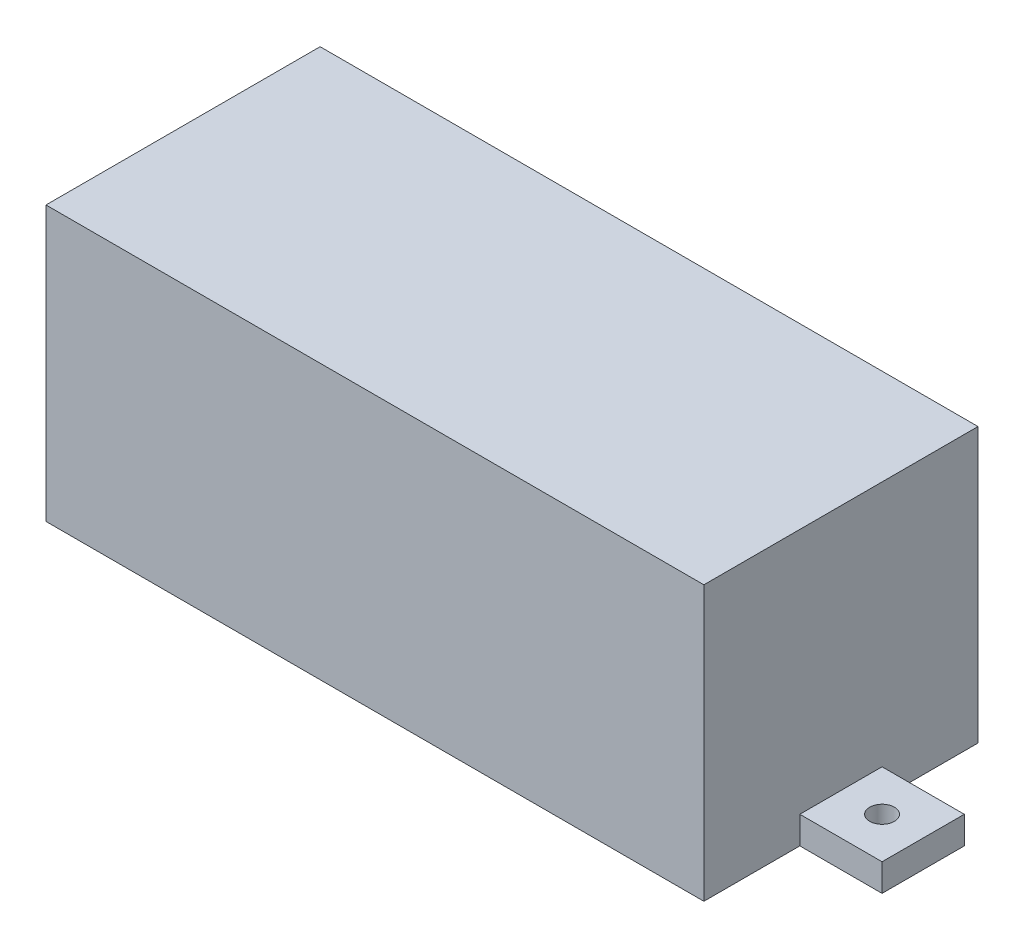
ISO-10303-21;
HEADER;
FILE_DESCRIPTION(('STEP AP214'),'2;1');
FILE_NAME('part.step','',(''),(''),'','','');
FILE_SCHEMA(('AUTOMOTIVE_DESIGN { 1 0 10303 214 1 1 1 1 }'));
ENDSEC;
DATA;
#1=APPLICATION_CONTEXT('core data for automotive mechanical design processes');
#2=APPLICATION_PROTOCOL_DEFINITION('international standard','automotive_design',2000,#1);
#3=PRODUCT_CONTEXT('',#1,'mechanical');
#4=PRODUCT('Part','Part','',(#3));
#5=PRODUCT_RELATED_PRODUCT_CATEGORY('part','',(#4));
#6=PRODUCT_DEFINITION_FORMATION('','',#4);
#7=PRODUCT_DEFINITION_CONTEXT('part definition',#1,'design');
#8=PRODUCT_DEFINITION('design','',#6,#7);
#9=PRODUCT_DEFINITION_SHAPE('','',#8);
#10=(LENGTH_UNIT() NAMED_UNIT(*) SI_UNIT(.MILLI.,.METRE.));
#11=(NAMED_UNIT(*) PLANE_ANGLE_UNIT() SI_UNIT($,.RADIAN.));
#12=(NAMED_UNIT(*) SI_UNIT($,.STERADIAN.) SOLID_ANGLE_UNIT());
#13=UNCERTAINTY_MEASURE_WITH_UNIT(LENGTH_MEASURE(1.E-05),#10,'distance_accuracy_value','');
#14=(GEOMETRIC_REPRESENTATION_CONTEXT(3) GLOBAL_UNCERTAINTY_ASSIGNED_CONTEXT((#13)) GLOBAL_UNIT_ASSIGNED_CONTEXT((#10,
#11,#12)) REPRESENTATION_CONTEXT('',''));
#15=CARTESIAN_POINT('',(0.,0.,0.));
#16=DIRECTION('',(0.,0.,1.));
#17=DIRECTION('',(1.,0.,0.));
#18=AXIS2_PLACEMENT_3D('',#15,#16,#17);
#19=CARTESIAN_POINT('',(120.,50.,0.));
#20=DIRECTION('',(-1.,0.,0.));
#21=DIRECTION('',(0.,0.,1.));
#22=AXIS2_PLACEMENT_3D('',#19,#20,#21);
#23=PLANE('',#22);
#24=DIRECTION('',(0.,-1.,0.));
#25=VECTOR('',#24,1.);
#26=CARTESIAN_POINT('',(120.,5.,-17.5));
#27=LINE('',#26,#25);
#28=CARTESIAN_POINT('',(120.,5.,-17.5));
#29=VERTEX_POINT('',#28);
#30=CARTESIAN_POINT('',(120.,0.,-17.5));
#31=VERTEX_POINT('',#30);
#32=EDGE_CURVE('E266',#29,#31,#27,.T.);
#33=ORIENTED_EDGE('',*,*,#32,.F.);
#34=DIRECTION('',(0.,0.,-1.));
#35=VECTOR('',#34,1.);
#36=CARTESIAN_POINT('',(120.,5.,0.));
#37=LINE('',#36,#35);
#38=CARTESIAN_POINT('',(120.,5.,-32.5));
#39=VERTEX_POINT('',#38);
#40=EDGE_CURVE('E247',#29,#39,#37,.T.);
#41=ORIENTED_EDGE('',*,*,#40,.T.);
#42=DIRECTION('',(0.,-1.,0.));
#43=VECTOR('',#42,1.);
#44=CARTESIAN_POINT('',(120.,5.,-32.5));
#45=LINE('',#44,#43);
#46=CARTESIAN_POINT('',(120.,0.,-32.5));
#47=VERTEX_POINT('',#46);
#48=EDGE_CURVE('E232',#39,#47,#45,.T.);
#49=ORIENTED_EDGE('',*,*,#48,.T.);
#50=DIRECTION('',(0.,0.,-1.));
#51=VECTOR('',#50,1.);
#52=CARTESIAN_POINT('',(120.,0.,0.));
#53=LINE('',#52,#51);
#54=CARTESIAN_POINT('',(120.,0.,-50.));
#55=VERTEX_POINT('',#54);
#56=EDGE_CURVE('E328',#47,#55,#53,.T.);
#57=ORIENTED_EDGE('',*,*,#56,.T.);
#58=DIRECTION('',(0.,-1.,0.));
#59=VECTOR('',#58,1.);
#60=CARTESIAN_POINT('',(120.,50.,-50.));
#61=LINE('',#60,#59);
#62=CARTESIAN_POINT('',(120.,50.,-50.));
#63=VERTEX_POINT('',#62);
#64=EDGE_CURVE('E347',#63,#55,#61,.T.);
#65=ORIENTED_EDGE('',*,*,#64,.F.);
#66=DIRECTION('',(0.,0.,-1.));
#67=VECTOR('',#66,1.);
#68=CARTESIAN_POINT('',(120.,50.,0.));
#69=LINE('',#68,#67);
#70=CARTESIAN_POINT('',(120.,50.,0.));
#71=VERTEX_POINT('',#70);
#72=EDGE_CURVE('E312',#71,#63,#69,.T.);
#73=ORIENTED_EDGE('',*,*,#72,.F.);
#74=DIRECTION('',(0.,-1.,0.));
#75=VECTOR('',#74,1.);
#76=CARTESIAN_POINT('',(120.,50.,0.));
#77=LINE('',#76,#75);
#78=CARTESIAN_POINT('',(120.,0.,0.));
#79=VERTEX_POINT('',#78);
#80=EDGE_CURVE('E351',#71,#79,#77,.T.);
#81=ORIENTED_EDGE('',*,*,#80,.T.);
#82=EDGE_CURVE('E329',#79,#31,#53,.T.);
#83=ORIENTED_EDGE('',*,*,#82,.T.);
#84=EDGE_LOOP('',(#33,#41,#49,#57,#65,#73,#81,#83));
#85=FACE_BOUND('',#84,.T.);
#86=ADVANCED_FACE('F44',(#85),#23,.F.);
#87=CARTESIAN_POINT('',(0.,50.,0.));
#88=DIRECTION('',(0.,0.,-1.));
#89=DIRECTION('',(-1.,0.,0.));
#90=AXIS2_PLACEMENT_3D('',#87,#88,#89);
#91=PLANE('',#90);
#92=DIRECTION('',(1.,0.,0.));
#93=VECTOR('',#92,1.);
#94=CARTESIAN_POINT('',(0.,0.,0.));
#95=LINE('',#94,#93);
#96=CARTESIAN_POINT('',(0.,0.,0.));
#97=VERTEX_POINT('',#96);
#98=EDGE_CURVE('E307',#97,#79,#95,.T.);
#99=ORIENTED_EDGE('',*,*,#98,.T.);
#100=ORIENTED_EDGE('',*,*,#80,.F.);
#101=DIRECTION('',(1.,0.,0.));
#102=VECTOR('',#101,1.);
#103=CARTESIAN_POINT('',(0.,50.,0.));
#104=LINE('',#103,#102);
#105=CARTESIAN_POINT('',(0.,50.,0.));
#106=VERTEX_POINT('',#105);
#107=EDGE_CURVE('E308',#106,#71,#104,.T.);
#108=ORIENTED_EDGE('',*,*,#107,.F.);
#109=DIRECTION('',(0.,-1.,0.));
#110=VECTOR('',#109,1.);
#111=CARTESIAN_POINT('',(0.,50.,0.));
#112=LINE('',#111,#110);
#113=EDGE_CURVE('E324',#106,#97,#112,.T.);
#114=ORIENTED_EDGE('',*,*,#113,.T.);
#115=EDGE_LOOP('',(#99,#100,#108,#114));
#116=FACE_BOUND('',#115,.T.);
#117=ADVANCED_FACE('F549',(#116),#91,.F.);
#118=CARTESIAN_POINT('',(0.,50.,-50.));
#119=DIRECTION('',(0.,0.,-1.));
#120=DIRECTION('',(-1.,0.,0.));
#121=AXIS2_PLACEMENT_3D('',#118,#119,#120);
#122=PLANE('',#121);
#123=DIRECTION('',(1.,0.,0.));
#124=VECTOR('',#123,1.);
#125=CARTESIAN_POINT('',(0.,0.,-50.));
#126=LINE('',#125,#124);
#127=CARTESIAN_POINT('',(0.,0.,-50.));
#128=VERTEX_POINT('',#127);
#129=EDGE_CURVE('E333',#128,#55,#126,.T.);
#130=ORIENTED_EDGE('',*,*,#129,.F.);
#131=DIRECTION('',(0.,-1.,0.));
#132=VECTOR('',#131,1.);
#133=CARTESIAN_POINT('',(0.,50.,-50.));
#134=LINE('',#133,#132);
#135=CARTESIAN_POINT('',(0.,50.,-50.));
#136=VERTEX_POINT('',#135);
#137=EDGE_CURVE('E343',#136,#128,#134,.T.);
#138=ORIENTED_EDGE('',*,*,#137,.F.);
#139=DIRECTION('',(1.,0.,0.));
#140=VECTOR('',#139,1.);
#141=CARTESIAN_POINT('',(0.,50.,-50.));
#142=LINE('',#141,#140);
#143=EDGE_CURVE('E316',#136,#63,#142,.T.);
#144=ORIENTED_EDGE('',*,*,#143,.T.);
#145=ORIENTED_EDGE('',*,*,#64,.T.);
#146=EDGE_LOOP('',(#130,#138,#144,#145));
#147=FACE_BOUND('',#146,.T.);
#148=ADVANCED_FACE('F710',(#147),#122,.T.);
#149=CARTESIAN_POINT('',(0.,50.,0.));
#150=DIRECTION('',(-1.,0.,0.));
#151=DIRECTION('',(0.,0.,1.));
#152=AXIS2_PLACEMENT_3D('',#149,#150,#151);
#153=PLANE('',#152);
#154=DIRECTION('',(0.,-1.,0.));
#155=VECTOR('',#154,1.);
#156=CARTESIAN_POINT('',(0.,5.,-32.5));
#157=LINE('',#156,#155);
#158=CARTESIAN_POINT('',(0.,5.,-32.5));
#159=VERTEX_POINT('',#158);
#160=CARTESIAN_POINT('',(0.,0.,-32.5));
#161=VERTEX_POINT('',#160);
#162=EDGE_CURVE('E285',#159,#161,#157,.T.);
#163=ORIENTED_EDGE('',*,*,#162,.F.);
#164=DIRECTION('',(0.,0.,-1.));
#165=VECTOR('',#164,1.);
#166=CARTESIAN_POINT('',(0.,5.,0.));
#167=LINE('',#166,#165);
#168=CARTESIAN_POINT('',(0.,5.,-17.5));
#169=VERTEX_POINT('',#168);
#170=EDGE_CURVE('E282',#169,#159,#167,.T.);
#171=ORIENTED_EDGE('',*,*,#170,.F.);
#172=DIRECTION('',(0.,-1.,0.));
#173=VECTOR('',#172,1.);
#174=CARTESIAN_POINT('',(0.,5.,-17.5));
#175=LINE('',#174,#173);
#176=CARTESIAN_POINT('',(0.,0.,-17.5));
#177=VERTEX_POINT('',#176);
#178=EDGE_CURVE('E297',#169,#177,#175,.T.);
#179=ORIENTED_EDGE('',*,*,#178,.T.);
#180=DIRECTION('',(0.,0.,-1.));
#181=VECTOR('',#180,1.);
#182=CARTESIAN_POINT('',(0.,0.,0.));
#183=LINE('',#182,#181);
#184=EDGE_CURVE('E313',#97,#177,#183,.T.);
#185=ORIENTED_EDGE('',*,*,#184,.F.);
#186=ORIENTED_EDGE('',*,*,#113,.F.);
#187=DIRECTION('',(0.,0.,-1.));
#188=VECTOR('',#187,1.);
#189=CARTESIAN_POINT('',(0.,50.,0.));
#190=LINE('',#189,#188);
#191=EDGE_CURVE('E320',#106,#136,#190,.T.);
#192=ORIENTED_EDGE('',*,*,#191,.T.);
#193=ORIENTED_EDGE('',*,*,#137,.T.);
#194=EDGE_CURVE('E337',#161,#128,#183,.T.);
#195=ORIENTED_EDGE('',*,*,#194,.F.);
#196=EDGE_LOOP('',(#163,#171,#179,#185,#186,#192,#193,#195));
#197=FACE_BOUND('',#196,.T.);
#198=ADVANCED_FACE('F705',(#197),#153,.T.);
#199=CARTESIAN_POINT('',(0.,50.,0.));
#200=DIRECTION('',(0.,1.,0.));
#201=DIRECTION('',(0.,0.,1.));
#202=AXIS2_PLACEMENT_3D('',#199,#200,#201);
#203=PLANE('',#202);
#204=ORIENTED_EDGE('',*,*,#107,.T.);
#205=ORIENTED_EDGE('',*,*,#72,.T.);
#206=ORIENTED_EDGE('',*,*,#143,.F.);
#207=ORIENTED_EDGE('',*,*,#191,.F.);
#208=EDGE_LOOP('',(#204,#205,#206,#207));
#209=FACE_BOUND('',#208,.T.);
#210=ADVANCED_FACE('F681',(#209),#203,.T.);
#211=CARTESIAN_POINT('',(0.,0.,0.));
#212=DIRECTION('',(0.,1.,0.));
#213=DIRECTION('',(0.,0.,1.));
#214=AXIS2_PLACEMENT_3D('',#211,#212,#213);
#215=PLANE('',#214);
#216=CARTESIAN_POINT('',(-7.5,0.,-25.));
#217=DIRECTION('',(0.,1.,0.));
#218=DIRECTION('',(0.,0.,1.));
#219=AXIS2_PLACEMENT_3D('',#216,#217,#218);
#220=CIRCLE('',#219,2.24999999999999);
#221=CARTESIAN_POINT('',(-7.5,0.,-22.75));
#222=VERTEX_POINT('',#221);
#223=EDGE_CURVE('E942',#222,#222,#220,.T.);
#224=ORIENTED_EDGE('',*,*,#223,.T.);
#225=EDGE_LOOP('',(#224));
#226=FACE_BOUND('',#225,.T.);
#227=CARTESIAN_POINT('',(127.5,0.,-25.));
#228=DIRECTION('',(0.,1.,0.));
#229=DIRECTION('',(0.,0.,1.));
#230=AXIS2_PLACEMENT_3D('',#227,#228,#229);
#231=CIRCLE('',#230,2.24999999999997);
#232=CARTESIAN_POINT('',(127.5,0.,-22.75));
#233=VERTEX_POINT('',#232);
#234=EDGE_CURVE('E258',#233,#233,#231,.T.);
#235=ORIENTED_EDGE('',*,*,#234,.T.);
#236=EDGE_LOOP('',(#235));
#237=FACE_BOUND('',#236,.T.);
#238=ORIENTED_EDGE('',*,*,#98,.F.);
#239=ORIENTED_EDGE('',*,*,#184,.T.);
#240=DIRECTION('',(-1.,0.,0.));
#241=VECTOR('',#240,1.);
#242=CARTESIAN_POINT('',(0.,0.,-17.5));
#243=LINE('',#242,#241);
#244=CARTESIAN_POINT('',(-15.,0.,-17.5));
#245=VERTEX_POINT('',#244);
#246=EDGE_CURVE('E157',#177,#245,#243,.T.);
#247=ORIENTED_EDGE('',*,*,#246,.T.);
#248=DIRECTION('',(0.,0.,1.));
#249=VECTOR('',#248,1.);
#250=CARTESIAN_POINT('',(-15.,0.,0.));
#251=LINE('',#250,#249);
#252=CARTESIAN_POINT('',(-15.,0.,-32.5));
#253=VERTEX_POINT('',#252);
#254=EDGE_CURVE('E289',#253,#245,#251,.T.);
#255=ORIENTED_EDGE('',*,*,#254,.F.);
#256=DIRECTION('',(-1.,0.,0.));
#257=VECTOR('',#256,1.);
#258=CARTESIAN_POINT('',(0.,0.,-32.5));
#259=LINE('',#258,#257);
#260=EDGE_CURVE('E231',#161,#253,#259,.T.);
#261=ORIENTED_EDGE('',*,*,#260,.F.);
#262=ORIENTED_EDGE('',*,*,#194,.T.);
#263=ORIENTED_EDGE('',*,*,#129,.T.);
#264=ORIENTED_EDGE('',*,*,#56,.F.);
#265=DIRECTION('',(1.,0.,0.));
#266=VECTOR('',#265,1.);
#267=CARTESIAN_POINT('',(0.,0.,-32.5));
#268=LINE('',#267,#266);
#269=CARTESIAN_POINT('',(135.,0.,-32.5));
#270=VERTEX_POINT('',#269);
#271=EDGE_CURVE('E149',#47,#270,#268,.T.);
#272=ORIENTED_EDGE('',*,*,#271,.T.);
#273=DIRECTION('',(0.,0.,1.));
#274=VECTOR('',#273,1.);
#275=CARTESIAN_POINT('',(135.,0.,0.));
#276=LINE('',#275,#274);
#277=CARTESIAN_POINT('',(135.,0.,-17.5));
#278=VERTEX_POINT('',#277);
#279=EDGE_CURVE('E228',#270,#278,#276,.T.);
#280=ORIENTED_EDGE('',*,*,#279,.T.);
#281=DIRECTION('',(1.,0.,0.));
#282=VECTOR('',#281,1.);
#283=CARTESIAN_POINT('',(0.,0.,-17.5));
#284=LINE('',#283,#282);
#285=EDGE_CURVE('E243',#31,#278,#284,.T.);
#286=ORIENTED_EDGE('',*,*,#285,.F.);
#287=ORIENTED_EDGE('',*,*,#82,.F.);
#288=EDGE_LOOP('',(#238,#239,#247,#255,#261,#262,#263,#264,#272,#280,#286,#287));
#289=FACE_BOUND('',#288,.T.);
#290=ADVANCED_FACE('F676',(#226,#237,#289),#215,.F.);
#291=CARTESIAN_POINT('',(0.,5.,-32.5));
#292=DIRECTION('',(0.,0.,1.));
#293=DIRECTION('',(1.,0.,0.));
#294=AXIS2_PLACEMENT_3D('',#291,#292,#293);
#295=PLANE('',#294);
#296=ORIENTED_EDGE('',*,*,#260,.T.);
#297=DIRECTION('',(0.,-1.,0.));
#298=VECTOR('',#297,1.);
#299=CARTESIAN_POINT('',(-15.,5.,-32.5));
#300=LINE('',#299,#298);
#301=CARTESIAN_POINT('',(-15.,5.,-32.5));
#302=VERTEX_POINT('',#301);
#303=EDGE_CURVE('E303',#302,#253,#300,.T.);
#304=ORIENTED_EDGE('',*,*,#303,.F.);
#305=DIRECTION('',(-1.,0.,0.));
#306=VECTOR('',#305,1.);
#307=CARTESIAN_POINT('',(0.,5.,-32.5));
#308=LINE('',#307,#306);
#309=EDGE_CURVE('E271',#159,#302,#308,.T.);
#310=ORIENTED_EDGE('',*,*,#309,.F.);
#311=ORIENTED_EDGE('',*,*,#162,.T.);
#312=EDGE_LOOP('',(#296,#304,#310,#311));
#313=FACE_BOUND('',#312,.T.);
#314=ADVANCED_FACE('F680',(#313),#295,.F.);
#315=CARTESIAN_POINT('',(-15.,5.,0.));
#316=DIRECTION('',(1.,0.,0.));
#317=DIRECTION('',(0.,0.,-1.));
#318=AXIS2_PLACEMENT_3D('',#315,#316,#317);
#319=PLANE('',#318);
#320=ORIENTED_EDGE('',*,*,#254,.T.);
#321=DIRECTION('',(0.,-1.,0.));
#322=VECTOR('',#321,1.);
#323=CARTESIAN_POINT('',(-15.,5.,-17.5));
#324=LINE('',#323,#322);
#325=CARTESIAN_POINT('',(-15.,5.,-17.5));
#326=VERTEX_POINT('',#325);
#327=EDGE_CURVE('E300',#326,#245,#324,.T.);
#328=ORIENTED_EDGE('',*,*,#327,.F.);
#329=DIRECTION('',(0.,0.,1.));
#330=VECTOR('',#329,1.);
#331=CARTESIAN_POINT('',(-15.,5.,0.));
#332=LINE('',#331,#330);
#333=EDGE_CURVE('E275',#302,#326,#332,.T.);
#334=ORIENTED_EDGE('',*,*,#333,.F.);
#335=ORIENTED_EDGE('',*,*,#303,.T.);
#336=EDGE_LOOP('',(#320,#328,#334,#335));
#337=FACE_BOUND('',#336,.T.);
#338=ADVANCED_FACE('F729',(#337),#319,.F.);
#339=CARTESIAN_POINT('',(0.,5.,-17.5));
#340=DIRECTION('',(0.,0.,1.));
#341=DIRECTION('',(1.,0.,0.));
#342=AXIS2_PLACEMENT_3D('',#339,#340,#341);
#343=PLANE('',#342);
#344=ORIENTED_EDGE('',*,*,#246,.F.);
#345=ORIENTED_EDGE('',*,*,#178,.F.);
#346=DIRECTION('',(-1.,0.,0.));
#347=VECTOR('',#346,1.);
#348=CARTESIAN_POINT('',(0.,5.,-17.5));
#349=LINE('',#348,#347);
#350=EDGE_CURVE('E278',#169,#326,#349,.T.);
#351=ORIENTED_EDGE('',*,*,#350,.T.);
#352=ORIENTED_EDGE('',*,*,#327,.T.);
#353=EDGE_LOOP('',(#344,#345,#351,#352));
#354=FACE_BOUND('',#353,.T.);
#355=ADVANCED_FACE('F667',(#354),#343,.T.);
#356=CARTESIAN_POINT('',(0.,5.,0.));
#357=DIRECTION('',(0.,1.,0.));
#358=DIRECTION('',(0.,0.,1.));
#359=AXIS2_PLACEMENT_3D('',#356,#357,#358);
#360=PLANE('',#359);
#361=CARTESIAN_POINT('',(-7.5,5.,-25.));
#362=DIRECTION('',(0.,1.,0.));
#363=DIRECTION('',(0.,0.,1.));
#364=AXIS2_PLACEMENT_3D('',#361,#362,#363);
#365=CIRCLE('',#364,2.24999999999999);
#366=CARTESIAN_POINT('',(-7.5,5.,-22.75));
#367=VERTEX_POINT('',#366);
#368=EDGE_CURVE('E947',#367,#367,#365,.T.);
#369=ORIENTED_EDGE('',*,*,#368,.F.);
#370=EDGE_LOOP('',(#369));
#371=FACE_BOUND('',#370,.T.);
#372=ORIENTED_EDGE('',*,*,#309,.T.);
#373=ORIENTED_EDGE('',*,*,#333,.T.);
#374=ORIENTED_EDGE('',*,*,#350,.F.);
#375=ORIENTED_EDGE('',*,*,#170,.T.);
#376=EDGE_LOOP('',(#372,#373,#374,#375));
#377=FACE_BOUND('',#376,.T.);
#378=ADVANCED_FACE('F663',(#371,#377),#360,.T.);
#379=CARTESIAN_POINT('',(135.,5.,0.));
#380=DIRECTION('',(1.,0.,0.));
#381=DIRECTION('',(0.,0.,-1.));
#382=AXIS2_PLACEMENT_3D('',#379,#380,#381);
#383=PLANE('',#382);
#384=ORIENTED_EDGE('',*,*,#279,.F.);
#385=DIRECTION('',(0.,-1.,0.));
#386=VECTOR('',#385,1.);
#387=CARTESIAN_POINT('',(135.,5.,-32.5));
#388=LINE('',#387,#386);
#389=CARTESIAN_POINT('',(135.,5.,-32.5));
#390=VERTEX_POINT('',#389);
#391=EDGE_CURVE('E223',#390,#270,#388,.T.);
#392=ORIENTED_EDGE('',*,*,#391,.F.);
#393=DIRECTION('',(0.,0.,1.));
#394=VECTOR('',#393,1.);
#395=CARTESIAN_POINT('',(135.,5.,0.));
#396=LINE('',#395,#394);
#397=CARTESIAN_POINT('',(135.,5.,-17.5));
#398=VERTEX_POINT('',#397);
#399=EDGE_CURVE('E226',#390,#398,#396,.T.);
#400=ORIENTED_EDGE('',*,*,#399,.T.);
#401=DIRECTION('',(0.,-1.,0.));
#402=VECTOR('',#401,1.);
#403=CARTESIAN_POINT('',(135.,5.,-17.5));
#404=LINE('',#403,#402);
#405=EDGE_CURVE('E255',#398,#278,#404,.T.);
#406=ORIENTED_EDGE('',*,*,#405,.T.);
#407=EDGE_LOOP('',(#384,#392,#400,#406));
#408=FACE_BOUND('',#407,.T.);
#409=ADVANCED_FACE('F225',(#408),#383,.T.);
#410=CARTESIAN_POINT('',(0.,5.,-32.5));
#411=DIRECTION('',(0.,0.,-1.));
#412=DIRECTION('',(-1.,0.,0.));
#413=AXIS2_PLACEMENT_3D('',#410,#411,#412);
#414=PLANE('',#413);
#415=ORIENTED_EDGE('',*,*,#271,.F.);
#416=ORIENTED_EDGE('',*,*,#48,.F.);
#417=DIRECTION('',(1.,0.,0.));
#418=VECTOR('',#417,1.);
#419=CARTESIAN_POINT('',(0.,5.,-32.5));
#420=LINE('',#419,#418);
#421=EDGE_CURVE('E238',#39,#390,#420,.T.);
#422=ORIENTED_EDGE('',*,*,#421,.T.);
#423=ORIENTED_EDGE('',*,*,#391,.T.);
#424=EDGE_LOOP('',(#415,#416,#422,#423));
#425=FACE_BOUND('',#424,.T.);
#426=ADVANCED_FACE('F245',(#425),#414,.T.);
#427=CARTESIAN_POINT('',(0.,5.,-17.5));
#428=DIRECTION('',(0.,0.,-1.));
#429=DIRECTION('',(-1.,0.,0.));
#430=AXIS2_PLACEMENT_3D('',#427,#428,#429);
#431=PLANE('',#430);
#432=ORIENTED_EDGE('',*,*,#285,.T.);
#433=ORIENTED_EDGE('',*,*,#405,.F.);
#434=DIRECTION('',(1.,0.,0.));
#435=VECTOR('',#434,1.);
#436=CARTESIAN_POINT('',(0.,5.,-17.5));
#437=LINE('',#436,#435);
#438=EDGE_CURVE('E240',#29,#398,#437,.T.);
#439=ORIENTED_EDGE('',*,*,#438,.F.);
#440=ORIENTED_EDGE('',*,*,#32,.T.);
#441=EDGE_LOOP('',(#432,#433,#439,#440));
#442=FACE_BOUND('',#441,.T.);
#443=ADVANCED_FACE('F653',(#442),#431,.F.);
#444=CARTESIAN_POINT('',(0.,5.,0.));
#445=DIRECTION('',(0.,1.,0.));
#446=DIRECTION('',(0.,0.,1.));
#447=AXIS2_PLACEMENT_3D('',#444,#445,#446);
#448=PLANE('',#447);
#449=CARTESIAN_POINT('',(127.5,5.,-25.));
#450=DIRECTION('',(0.,1.,0.));
#451=DIRECTION('',(0.,0.,1.));
#452=AXIS2_PLACEMENT_3D('',#449,#450,#451);
#453=CIRCLE('',#452,2.25);
#454=CARTESIAN_POINT('',(127.5,5.,-22.75));
#455=VERTEX_POINT('',#454);
#456=EDGE_CURVE('E940',#455,#455,#453,.T.);
#457=ORIENTED_EDGE('',*,*,#456,.F.);
#458=EDGE_LOOP('',(#457));
#459=FACE_BOUND('',#458,.T.);
#460=ORIENTED_EDGE('',*,*,#399,.F.);
#461=ORIENTED_EDGE('',*,*,#421,.F.);
#462=ORIENTED_EDGE('',*,*,#40,.F.);
#463=ORIENTED_EDGE('',*,*,#438,.T.);
#464=EDGE_LOOP('',(#460,#461,#462,#463));
#465=FACE_BOUND('',#464,.T.);
#466=ADVANCED_FACE('F236',(#459,#465),#448,.T.);
#467=CARTESIAN_POINT('',(127.5,5.,-25.));
#468=DIRECTION('',(0.,1.,0.));
#469=DIRECTION('',(0.,0.,1.));
#470=AXIS2_PLACEMENT_3D('',#467,#468,#469);
#471=CYLINDRICAL_SURFACE('',#470,2.24999999999999);
#472=ORIENTED_EDGE('',*,*,#234,.F.);
#473=EDGE_LOOP('',(#472));
#474=FACE_BOUND('',#473,.T.);
#475=ORIENTED_EDGE('',*,*,#456,.T.);
#476=EDGE_LOOP('',(#475));
#477=FACE_BOUND('',#476,.T.);
#478=ADVANCED_FACE('F652',(#474,#477),#471,.F.);
#479=CARTESIAN_POINT('',(-7.5,5.,-25.));
#480=DIRECTION('',(0.,1.,0.));
#481=DIRECTION('',(0.,0.,1.));
#482=AXIS2_PLACEMENT_3D('',#479,#480,#481);
#483=CYLINDRICAL_SURFACE('',#482,2.24999999999999);
#484=ORIENTED_EDGE('',*,*,#223,.F.);
#485=EDGE_LOOP('',(#484));
#486=FACE_BOUND('',#485,.T.);
#487=ORIENTED_EDGE('',*,*,#368,.T.);
#488=EDGE_LOOP('',(#487));
#489=FACE_BOUND('',#488,.T.);
#490=ADVANCED_FACE('F690',(#486,#489),#483,.F.);
#491=CLOSED_SHELL('',(#86,#117,#148,#198,#210,#290,#314,#338,#355,#378,#409,#426,#443,#466,#478,#490));
#492=CARTESIAN_POINT('',(118.,50.,0.));
#493=DIRECTION('',(-1.,0.,0.));
#494=DIRECTION('',(0.,0.,1.));
#495=AXIS2_PLACEMENT_3D('',#492,#493,#494);
#496=PLANE('',#495);
#497=DIRECTION('',(0.,-1.,0.));
#498=VECTOR('',#497,1.);
#499=CARTESIAN_POINT('',(118.,50.,-19.5));
#500=LINE('',#499,#498);
#501=CARTESIAN_POINT('',(118.,3.,-19.5));
#502=VERTEX_POINT('',#501);
#503=CARTESIAN_POINT('',(118.,2.,-19.5));
#504=VERTEX_POINT('',#503);
#505=EDGE_CURVE('E360',#502,#504,#500,.T.);
#506=ORIENTED_EDGE('',*,*,#505,.T.);
#507=DIRECTION('',(0.,0.,-1.));
#508=VECTOR('',#507,1.);
#509=CARTESIAN_POINT('',(118.,2.,0.));
#510=LINE('',#509,#508);
#511=CARTESIAN_POINT('',(118.,2.,-2.00000000000001));
#512=VERTEX_POINT('',#511);
#513=EDGE_CURVE('E474',#512,#504,#510,.T.);
#514=ORIENTED_EDGE('',*,*,#513,.F.);
#515=DIRECTION('',(0.,-1.,0.));
#516=VECTOR('',#515,1.);
#517=CARTESIAN_POINT('',(118.,50.,-2.00000000000001));
#518=LINE('',#517,#516);
#519=CARTESIAN_POINT('',(118.,48.,-2.00000000000001));
#520=VERTEX_POINT('',#519);
#521=EDGE_CURVE('E478',#520,#512,#518,.T.);
#522=ORIENTED_EDGE('',*,*,#521,.F.);
#523=DIRECTION('',(0.,0.,-1.));
#524=VECTOR('',#523,1.);
#525=CARTESIAN_POINT('',(118.,48.,0.));
#526=LINE('',#525,#524);
#527=CARTESIAN_POINT('',(118.,48.,-48.));
#528=VERTEX_POINT('',#527);
#529=EDGE_CURVE('E135',#520,#528,#526,.T.);
#530=ORIENTED_EDGE('',*,*,#529,.T.);
#531=DIRECTION('',(0.,-1.,0.));
#532=VECTOR('',#531,1.);
#533=CARTESIAN_POINT('',(118.,50.,-48.));
#534=LINE('',#533,#532);
#535=CARTESIAN_POINT('',(118.,2.,-48.));
#536=VERTEX_POINT('',#535);
#537=EDGE_CURVE('E461',#528,#536,#534,.T.);
#538=ORIENTED_EDGE('',*,*,#537,.T.);
#539=DIRECTION('',(0.,0.,-1.));
#540=VECTOR('',#539,1.);
#541=CARTESIAN_POINT('',(118.,2.,0.));
#542=LINE('',#541,#540);
#543=CARTESIAN_POINT('',(118.,2.,-30.5));
#544=VERTEX_POINT('',#543);
#545=EDGE_CURVE('E141',#544,#536,#542,.T.);
#546=ORIENTED_EDGE('',*,*,#545,.F.);
#547=DIRECTION('',(0.,-1.,0.));
#548=VECTOR('',#547,1.);
#549=CARTESIAN_POINT('',(118.,50.,-30.5));
#550=LINE('',#549,#548);
#551=CARTESIAN_POINT('',(118.,3.,-30.5));
#552=VERTEX_POINT('',#551);
#553=EDGE_CURVE('E483',#552,#544,#550,.T.);
#554=ORIENTED_EDGE('',*,*,#553,.F.);
#555=DIRECTION('',(0.,0.,-1.));
#556=VECTOR('',#555,1.);
#557=CARTESIAN_POINT('',(118.,3.,0.));
#558=LINE('',#557,#556);
#559=EDGE_CURVE('E48',#502,#552,#558,.T.);
#560=ORIENTED_EDGE('',*,*,#559,.F.);
#561=EDGE_LOOP('',(#506,#514,#522,#530,#538,#546,#554,#560));
#562=FACE_BOUND('',#561,.T.);
#563=ADVANCED_FACE('F494',(#562),#496,.T.);
#564=CARTESIAN_POINT('',(0.,50.,-2.));
#565=DIRECTION('',(0.,0.,-1.));
#566=DIRECTION('',(-1.,0.,0.));
#567=AXIS2_PLACEMENT_3D('',#564,#565,#566);
#568=PLANE('',#567);
#569=DIRECTION('',(1.,0.,0.));
#570=VECTOR('',#569,1.);
#571=CARTESIAN_POINT('',(0.,2.,-2.));
#572=LINE('',#571,#570);
#573=CARTESIAN_POINT('',(2.,2.,-2.));
#574=VERTEX_POINT('',#573);
#575=EDGE_CURVE('E470',#574,#512,#572,.T.);
#576=ORIENTED_EDGE('',*,*,#575,.F.);
#577=DIRECTION('',(0.,-1.,0.));
#578=VECTOR('',#577,1.);
#579=CARTESIAN_POINT('',(2.,50.,-2.));
#580=LINE('',#579,#578);
#581=CARTESIAN_POINT('',(2.,48.,-2.));
#582=VERTEX_POINT('',#581);
#583=EDGE_CURVE('E467',#582,#574,#580,.T.);
#584=ORIENTED_EDGE('',*,*,#583,.F.);
#585=DIRECTION('',(1.,0.,0.));
#586=VECTOR('',#585,1.);
#587=CARTESIAN_POINT('',(0.,48.,-2.));
#588=LINE('',#587,#586);
#589=EDGE_CURVE('E446',#582,#520,#588,.T.);
#590=ORIENTED_EDGE('',*,*,#589,.T.);
#591=ORIENTED_EDGE('',*,*,#521,.T.);
#592=EDGE_LOOP('',(#576,#584,#590,#591));
#593=FACE_BOUND('',#592,.T.);
#594=ADVANCED_FACE('F503',(#593),#568,.T.);
#595=CARTESIAN_POINT('',(0.,50.,-48.));
#596=DIRECTION('',(0.,0.,-1.));
#597=DIRECTION('',(-1.,0.,0.));
#598=AXIS2_PLACEMENT_3D('',#595,#596,#597);
#599=PLANE('',#598);
#600=DIRECTION('',(1.,0.,0.));
#601=VECTOR('',#600,1.);
#602=CARTESIAN_POINT('',(0.,2.,-48.));
#603=LINE('',#602,#601);
#604=CARTESIAN_POINT('',(2.,2.,-48.));
#605=VERTEX_POINT('',#604);
#606=EDGE_CURVE('E421',#605,#536,#603,.T.);
#607=ORIENTED_EDGE('',*,*,#606,.T.);
#608=ORIENTED_EDGE('',*,*,#537,.F.);
#609=DIRECTION('',(1.,0.,0.));
#610=VECTOR('',#609,1.);
#611=CARTESIAN_POINT('',(0.,48.,-48.));
#612=LINE('',#611,#610);
#613=CARTESIAN_POINT('',(2.,48.,-48.));
#614=VERTEX_POINT('',#613);
#615=EDGE_CURVE('E464',#614,#528,#612,.T.);
#616=ORIENTED_EDGE('',*,*,#615,.F.);
#617=DIRECTION('',(0.,-1.,0.));
#618=VECTOR('',#617,1.);
#619=CARTESIAN_POINT('',(2.,50.,-48.));
#620=LINE('',#619,#618);
#621=EDGE_CURVE('E449',#614,#605,#620,.T.);
#622=ORIENTED_EDGE('',*,*,#621,.T.);
#623=EDGE_LOOP('',(#607,#608,#616,#622));
#624=FACE_BOUND('',#623,.T.);
#625=ADVANCED_FACE('F512',(#624),#599,.F.);
#626=CARTESIAN_POINT('',(2.,50.,0.));
#627=DIRECTION('',(-1.,0.,0.));
#628=DIRECTION('',(0.,0.,1.));
#629=AXIS2_PLACEMENT_3D('',#626,#627,#628);
#630=PLANE('',#629);
#631=DIRECTION('',(0.,-1.,0.));
#632=VECTOR('',#631,1.);
#633=CARTESIAN_POINT('',(2.,5.,-30.5));
#634=LINE('',#633,#632);
#635=CARTESIAN_POINT('',(2.,3.,-30.5));
#636=VERTEX_POINT('',#635);
#637=CARTESIAN_POINT('',(2.,2.,-30.5));
#638=VERTEX_POINT('',#637);
#639=EDGE_CURVE('E406',#636,#638,#634,.T.);
#640=ORIENTED_EDGE('',*,*,#639,.T.);
#641=DIRECTION('',(0.,0.,-1.));
#642=VECTOR('',#641,1.);
#643=CARTESIAN_POINT('',(2.,2.,0.));
#644=LINE('',#643,#642);
#645=EDGE_CURVE('E425',#638,#605,#644,.T.);
#646=ORIENTED_EDGE('',*,*,#645,.T.);
#647=ORIENTED_EDGE('',*,*,#621,.F.);
#648=DIRECTION('',(0.,0.,-1.));
#649=VECTOR('',#648,1.);
#650=CARTESIAN_POINT('',(2.,48.,0.));
#651=LINE('',#650,#649);
#652=EDGE_CURVE('E453',#582,#614,#651,.T.);
#653=ORIENTED_EDGE('',*,*,#652,.F.);
#654=ORIENTED_EDGE('',*,*,#583,.T.);
#655=DIRECTION('',(0.,0.,-1.));
#656=VECTOR('',#655,1.);
#657=CARTESIAN_POINT('',(2.,2.,0.));
#658=LINE('',#657,#656);
#659=CARTESIAN_POINT('',(2.,2.,-19.5));
#660=VERTEX_POINT('',#659);
#661=EDGE_CURVE('E432',#574,#660,#658,.T.);
#662=ORIENTED_EDGE('',*,*,#661,.T.);
#663=DIRECTION('',(0.,-1.,0.));
#664=VECTOR('',#663,1.);
#665=CARTESIAN_POINT('',(2.,5.,-19.5));
#666=LINE('',#665,#664);
#667=CARTESIAN_POINT('',(2.,3.,-19.5));
#668=VERTEX_POINT('',#667);
#669=EDGE_CURVE('E457',#668,#660,#666,.T.);
#670=ORIENTED_EDGE('',*,*,#669,.F.);
#671=DIRECTION('',(0.,0.,-1.));
#672=VECTOR('',#671,1.);
#673=CARTESIAN_POINT('',(2.,3.,0.));
#674=LINE('',#673,#672);
#675=EDGE_CURVE('E381',#668,#636,#674,.T.);
#676=ORIENTED_EDGE('',*,*,#675,.T.);
#677=EDGE_LOOP('',(#640,#646,#647,#653,#654,#662,#670,#676));
#678=FACE_BOUND('',#677,.T.);
#679=ADVANCED_FACE('F507',(#678),#630,.F.);
#680=CARTESIAN_POINT('',(0.,48.,0.));
#681=DIRECTION('',(0.,1.,0.));
#682=DIRECTION('',(0.,0.,1.));
#683=AXIS2_PLACEMENT_3D('',#680,#681,#682);
#684=PLANE('',#683);
#685=ORIENTED_EDGE('',*,*,#589,.F.);
#686=ORIENTED_EDGE('',*,*,#652,.T.);
#687=ORIENTED_EDGE('',*,*,#615,.T.);
#688=ORIENTED_EDGE('',*,*,#529,.F.);
#689=EDGE_LOOP('',(#685,#686,#687,#688));
#690=FACE_BOUND('',#689,.T.);
#691=ADVANCED_FACE('F505',(#690),#684,.F.);
#692=CARTESIAN_POINT('',(0.,2.,0.));
#693=DIRECTION('',(0.,1.,0.));
#694=DIRECTION('',(0.,0.,1.));
#695=AXIS2_PLACEMENT_3D('',#692,#693,#694);
#696=PLANE('',#695);
#697=CARTESIAN_POINT('',(-7.5,2.,-25.));
#698=DIRECTION('',(0.,1.,0.));
#699=DIRECTION('',(0.,0.,1.));
#700=AXIS2_PLACEMENT_3D('',#697,#698,#699);
#701=CIRCLE('',#700,4.24999999999999);
#702=CARTESIAN_POINT('',(-7.5,2.,-20.75));
#703=VERTEX_POINT('',#702);
#704=EDGE_CURVE('E440',#703,#703,#701,.T.);
#705=ORIENTED_EDGE('',*,*,#704,.F.);
#706=EDGE_LOOP('',(#705));
#707=FACE_BOUND('',#706,.T.);
#708=CARTESIAN_POINT('',(127.5,2.,-25.));
#709=DIRECTION('',(0.,1.,0.));
#710=DIRECTION('',(0.,0.,1.));
#711=AXIS2_PLACEMENT_3D('',#708,#709,#710);
#712=CIRCLE('',#711,4.24999999999999);
#713=CARTESIAN_POINT('',(127.5,2.,-20.75));
#714=VERTEX_POINT('',#713);
#715=EDGE_CURVE('E436',#714,#714,#712,.T.);
#716=ORIENTED_EDGE('',*,*,#715,.F.);
#717=EDGE_LOOP('',(#716));
#718=FACE_BOUND('',#717,.T.);
#719=ORIENTED_EDGE('',*,*,#575,.T.);
#720=ORIENTED_EDGE('',*,*,#513,.T.);
#721=DIRECTION('',(1.,0.,0.));
#722=VECTOR('',#721,1.);
#723=CARTESIAN_POINT('',(0.,2.,-19.5));
#724=LINE('',#723,#722);
#725=CARTESIAN_POINT('',(133.,2.,-19.5));
#726=VERTEX_POINT('',#725);
#727=EDGE_CURVE('E363',#504,#726,#724,.T.);
#728=ORIENTED_EDGE('',*,*,#727,.T.);
#729=DIRECTION('',(0.,0.,1.));
#730=VECTOR('',#729,1.);
#731=CARTESIAN_POINT('',(133.,2.,0.));
#732=LINE('',#731,#730);
#733=CARTESIAN_POINT('',(133.,2.,-30.5));
#734=VERTEX_POINT('',#733);
#735=EDGE_CURVE('E413',#734,#726,#732,.T.);
#736=ORIENTED_EDGE('',*,*,#735,.F.);
#737=DIRECTION('',(1.,0.,0.));
#738=VECTOR('',#737,1.);
#739=CARTESIAN_POINT('',(0.,2.,-30.5));
#740=LINE('',#739,#738);
#741=EDGE_CURVE('E417',#544,#734,#740,.T.);
#742=ORIENTED_EDGE('',*,*,#741,.F.);
#743=ORIENTED_EDGE('',*,*,#545,.T.);
#744=ORIENTED_EDGE('',*,*,#606,.F.);
#745=ORIENTED_EDGE('',*,*,#645,.F.);
#746=DIRECTION('',(-1.,0.,0.));
#747=VECTOR('',#746,1.);
#748=CARTESIAN_POINT('',(0.,2.,-30.5));
#749=LINE('',#748,#747);
#750=CARTESIAN_POINT('',(-13.,2.,-30.5));
#751=VERTEX_POINT('',#750);
#752=EDGE_CURVE('E409',#638,#751,#749,.T.);
#753=ORIENTED_EDGE('',*,*,#752,.T.);
#754=DIRECTION('',(0.,0.,1.));
#755=VECTOR('',#754,1.);
#756=CARTESIAN_POINT('',(-13.,2.,0.));
#757=LINE('',#756,#755);
#758=CARTESIAN_POINT('',(-13.,2.,-19.5));
#759=VERTEX_POINT('',#758);
#760=EDGE_CURVE('E402',#751,#759,#757,.T.);
#761=ORIENTED_EDGE('',*,*,#760,.T.);
#762=DIRECTION('',(-1.,0.,0.));
#763=VECTOR('',#762,1.);
#764=CARTESIAN_POINT('',(0.,2.,-19.5));
#765=LINE('',#764,#763);
#766=EDGE_CURVE('E428',#660,#759,#765,.T.);
#767=ORIENTED_EDGE('',*,*,#766,.F.);
#768=ORIENTED_EDGE('',*,*,#661,.F.);
#769=EDGE_LOOP('',(#719,#720,#728,#736,#742,#743,#744,#745,#753,#761,#767,#768));
#770=FACE_BOUND('',#769,.T.);
#771=ADVANCED_FACE('F498',(#707,#718,#770),#696,.T.);
#772=CARTESIAN_POINT('',(0.,5.,-30.5));
#773=DIRECTION('',(0.,0.,1.));
#774=DIRECTION('',(1.,0.,0.));
#775=AXIS2_PLACEMENT_3D('',#772,#773,#774);
#776=PLANE('',#775);
#777=ORIENTED_EDGE('',*,*,#752,.F.);
#778=ORIENTED_EDGE('',*,*,#639,.F.);
#779=DIRECTION('',(-1.,0.,0.));
#780=VECTOR('',#779,1.);
#781=CARTESIAN_POINT('',(0.,3.,-30.5));
#782=LINE('',#781,#780);
#783=CARTESIAN_POINT('',(-13.,3.,-30.5));
#784=VERTEX_POINT('',#783);
#785=EDGE_CURVE('E387',#636,#784,#782,.T.);
#786=ORIENTED_EDGE('',*,*,#785,.T.);
#787=DIRECTION('',(0.,-1.,0.));
#788=VECTOR('',#787,1.);
#789=CARTESIAN_POINT('',(-13.,5.,-30.5));
#790=LINE('',#789,#788);
#791=EDGE_CURVE('E398',#784,#751,#790,.T.);
#792=ORIENTED_EDGE('',*,*,#791,.T.);
#793=EDGE_LOOP('',(#777,#778,#786,#792));
#794=FACE_BOUND('',#793,.T.);
#795=ADVANCED_FACE('F516',(#794),#776,.T.);
#796=CARTESIAN_POINT('',(-13.,5.,0.));
#797=DIRECTION('',(1.,0.,0.));
#798=DIRECTION('',(0.,0.,-1.));
#799=AXIS2_PLACEMENT_3D('',#796,#797,#798);
#800=PLANE('',#799);
#801=ORIENTED_EDGE('',*,*,#760,.F.);
#802=ORIENTED_EDGE('',*,*,#791,.F.);
#803=DIRECTION('',(0.,0.,1.));
#804=VECTOR('',#803,1.);
#805=CARTESIAN_POINT('',(-13.,3.,0.));
#806=LINE('',#805,#804);
#807=CARTESIAN_POINT('',(-13.,3.,-19.5));
#808=VERTEX_POINT('',#807);
#809=EDGE_CURVE('E384',#784,#808,#806,.T.);
#810=ORIENTED_EDGE('',*,*,#809,.T.);
#811=DIRECTION('',(0.,-1.,0.));
#812=VECTOR('',#811,1.);
#813=CARTESIAN_POINT('',(-13.,5.,-19.5));
#814=LINE('',#813,#812);
#815=EDGE_CURVE('E391',#808,#759,#814,.T.);
#816=ORIENTED_EDGE('',*,*,#815,.T.);
#817=EDGE_LOOP('',(#801,#802,#810,#816));
#818=FACE_BOUND('',#817,.T.);
#819=ADVANCED_FACE('F520',(#818),#800,.T.);
#820=CARTESIAN_POINT('',(0.,5.,-19.5));
#821=DIRECTION('',(0.,0.,1.));
#822=DIRECTION('',(1.,0.,0.));
#823=AXIS2_PLACEMENT_3D('',#820,#821,#822);
#824=PLANE('',#823);
#825=ORIENTED_EDGE('',*,*,#766,.T.);
#826=ORIENTED_EDGE('',*,*,#815,.F.);
#827=DIRECTION('',(-1.,0.,0.));
#828=VECTOR('',#827,1.);
#829=CARTESIAN_POINT('',(0.,3.,-19.5));
#830=LINE('',#829,#828);
#831=EDGE_CURVE('E394',#668,#808,#830,.T.);
#832=ORIENTED_EDGE('',*,*,#831,.F.);
#833=ORIENTED_EDGE('',*,*,#669,.T.);
#834=EDGE_LOOP('',(#825,#826,#832,#833));
#835=FACE_BOUND('',#834,.T.);
#836=ADVANCED_FACE('F524',(#835),#824,.F.);
#837=CARTESIAN_POINT('',(0.,3.,0.));
#838=DIRECTION('',(0.,1.,0.));
#839=DIRECTION('',(0.,0.,1.));
#840=AXIS2_PLACEMENT_3D('',#837,#838,#839);
#841=PLANE('',#840);
#842=CARTESIAN_POINT('',(-7.5,3.,-25.));
#843=DIRECTION('',(0.,1.,0.));
#844=DIRECTION('',(0.,0.,1.));
#845=AXIS2_PLACEMENT_3D('',#842,#843,#844);
#846=CIRCLE('',#845,4.24999999999999);
#847=CARTESIAN_POINT('',(-7.5,3.,-20.75));
#848=VERTEX_POINT('',#847);
#849=EDGE_CURVE('E11',#848,#848,#846,.T.);
#850=ORIENTED_EDGE('',*,*,#849,.T.);
#851=EDGE_LOOP('',(#850));
#852=FACE_BOUND('',#851,.T.);
#853=ORIENTED_EDGE('',*,*,#785,.F.);
#854=ORIENTED_EDGE('',*,*,#675,.F.);
#855=ORIENTED_EDGE('',*,*,#831,.T.);
#856=ORIENTED_EDGE('',*,*,#809,.F.);
#857=EDGE_LOOP('',(#853,#854,#855,#856));
#858=FACE_BOUND('',#857,.T.);
#859=ADVANCED_FACE('F527',(#852,#858),#841,.F.);
#860=CARTESIAN_POINT('',(133.,5.,0.));
#861=DIRECTION('',(1.,0.,0.));
#862=DIRECTION('',(0.,0.,-1.));
#863=AXIS2_PLACEMENT_3D('',#860,#861,#862);
#864=PLANE('',#863);
#865=ORIENTED_EDGE('',*,*,#735,.T.);
#866=DIRECTION('',(0.,-1.,0.));
#867=VECTOR('',#866,1.);
#868=CARTESIAN_POINT('',(133.,5.,-19.5));
#869=LINE('',#868,#867);
#870=CARTESIAN_POINT('',(133.,3.,-19.5));
#871=VERTEX_POINT('',#870);
#872=EDGE_CURVE('E374',#871,#726,#869,.T.);
#873=ORIENTED_EDGE('',*,*,#872,.F.);
#874=DIRECTION('',(0.,0.,1.));
#875=VECTOR('',#874,1.);
#876=CARTESIAN_POINT('',(133.,3.,0.));
#877=LINE('',#876,#875);
#878=CARTESIAN_POINT('',(133.,3.,-30.5));
#879=VERTEX_POINT('',#878);
#880=EDGE_CURVE('E377',#879,#871,#877,.T.);
#881=ORIENTED_EDGE('',*,*,#880,.F.);
#882=DIRECTION('',(0.,-1.,0.));
#883=VECTOR('',#882,1.);
#884=CARTESIAN_POINT('',(133.,5.,-30.5));
#885=LINE('',#884,#883);
#886=EDGE_CURVE('E367',#879,#734,#885,.T.);
#887=ORIENTED_EDGE('',*,*,#886,.T.);
#888=EDGE_LOOP('',(#865,#873,#881,#887));
#889=FACE_BOUND('',#888,.T.);
#890=ADVANCED_FACE('F529',(#889),#864,.F.);
#891=CARTESIAN_POINT('',(0.,5.,-30.5));
#892=DIRECTION('',(0.,0.,-1.));
#893=DIRECTION('',(-1.,0.,0.));
#894=AXIS2_PLACEMENT_3D('',#891,#892,#893);
#895=PLANE('',#894);
#896=ORIENTED_EDGE('',*,*,#741,.T.);
#897=ORIENTED_EDGE('',*,*,#886,.F.);
#898=DIRECTION('',(1.,0.,0.));
#899=VECTOR('',#898,1.);
#900=CARTESIAN_POINT('',(0.,3.,-30.5));
#901=LINE('',#900,#899);
#902=EDGE_CURVE('E370',#552,#879,#901,.T.);
#903=ORIENTED_EDGE('',*,*,#902,.F.);
#904=ORIENTED_EDGE('',*,*,#553,.T.);
#905=EDGE_LOOP('',(#896,#897,#903,#904));
#906=FACE_BOUND('',#905,.T.);
#907=ADVANCED_FACE('F537',(#906),#895,.F.);
#908=CARTESIAN_POINT('',(0.,5.,-19.5));
#909=DIRECTION('',(0.,0.,-1.));
#910=DIRECTION('',(-1.,0.,0.));
#911=AXIS2_PLACEMENT_3D('',#908,#909,#910);
#912=PLANE('',#911);
#913=ORIENTED_EDGE('',*,*,#727,.F.);
#914=ORIENTED_EDGE('',*,*,#505,.F.);
#915=DIRECTION('',(1.,0.,0.));
#916=VECTOR('',#915,1.);
#917=CARTESIAN_POINT('',(0.,3.,-19.5));
#918=LINE('',#917,#916);
#919=EDGE_CURVE('E65',#502,#871,#918,.T.);
#920=ORIENTED_EDGE('',*,*,#919,.T.);
#921=ORIENTED_EDGE('',*,*,#872,.T.);
#922=EDGE_LOOP('',(#913,#914,#920,#921));
#923=FACE_BOUND('',#922,.T.);
#924=ADVANCED_FACE('F496',(#923),#912,.T.);
#925=CARTESIAN_POINT('',(0.,3.,0.));
#926=DIRECTION('',(0.,1.,0.));
#927=DIRECTION('',(0.,0.,1.));
#928=AXIS2_PLACEMENT_3D('',#925,#926,#927);
#929=PLANE('',#928);
#930=CARTESIAN_POINT('',(127.5,3.,-25.));
#931=DIRECTION('',(0.,1.,0.));
#932=DIRECTION('',(0.,0.,1.));
#933=AXIS2_PLACEMENT_3D('',#930,#931,#932);
#934=CIRCLE('',#933,4.24999999999999);
#935=CARTESIAN_POINT('',(127.5,3.,-20.75));
#936=VERTEX_POINT('',#935);
#937=EDGE_CURVE('E56',#936,#936,#934,.T.);
#938=ORIENTED_EDGE('',*,*,#937,.T.);
#939=EDGE_LOOP('',(#938));
#940=FACE_BOUND('',#939,.T.);
#941=ORIENTED_EDGE('',*,*,#880,.T.);
#942=ORIENTED_EDGE('',*,*,#919,.F.);
#943=ORIENTED_EDGE('',*,*,#559,.T.);
#944=ORIENTED_EDGE('',*,*,#902,.T.);
#945=EDGE_LOOP('',(#941,#942,#943,#944));
#946=FACE_BOUND('',#945,.T.);
#947=ADVANCED_FACE('F492',(#940,#946),#929,.F.);
#948=CARTESIAN_POINT('',(127.5,5.,-25.));
#949=DIRECTION('',(0.,1.,0.));
#950=DIRECTION('',(0.,0.,1.));
#951=AXIS2_PLACEMENT_3D('',#948,#949,#950);
#952=CYLINDRICAL_SURFACE('',#951,4.24999999999999);
#953=ORIENTED_EDGE('',*,*,#715,.T.);
#954=EDGE_LOOP('',(#953));
#955=FACE_BOUND('',#954,.T.);
#956=ORIENTED_EDGE('',*,*,#937,.F.);
#957=EDGE_LOOP('',(#956));
#958=FACE_BOUND('',#957,.T.);
#959=ADVANCED_FACE('F602',(#955,#958),#952,.T.);
#960=CARTESIAN_POINT('',(-7.5,5.,-25.));
#961=DIRECTION('',(0.,1.,0.));
#962=DIRECTION('',(0.,0.,1.));
#963=AXIS2_PLACEMENT_3D('',#960,#961,#962);
#964=CYLINDRICAL_SURFACE('',#963,4.24999999999999);
#965=ORIENTED_EDGE('',*,*,#704,.T.);
#966=EDGE_LOOP('',(#965));
#967=FACE_BOUND('',#966,.T.);
#968=ORIENTED_EDGE('',*,*,#849,.F.);
#969=EDGE_LOOP('',(#968));
#970=FACE_BOUND('',#969,.T.);
#971=ADVANCED_FACE('F46',(#967,#970),#964,.T.);
#972=CLOSED_SHELL('',(#563,#594,#625,#679,#691,#771,#795,#819,#836,#859,#890,#907,#924,#947,
#959,#971));
#973=ORIENTED_CLOSED_SHELL('',*,#972,.T.);
#974=BREP_WITH_VOIDS('B2',#491,(#973));
#975=ADVANCED_BREP_SHAPE_REPRESENTATION('',(#18,#974),#14);
#976=SHAPE_DEFINITION_REPRESENTATION(#9,#975);
ENDSEC;
END-ISO-10303-21;
